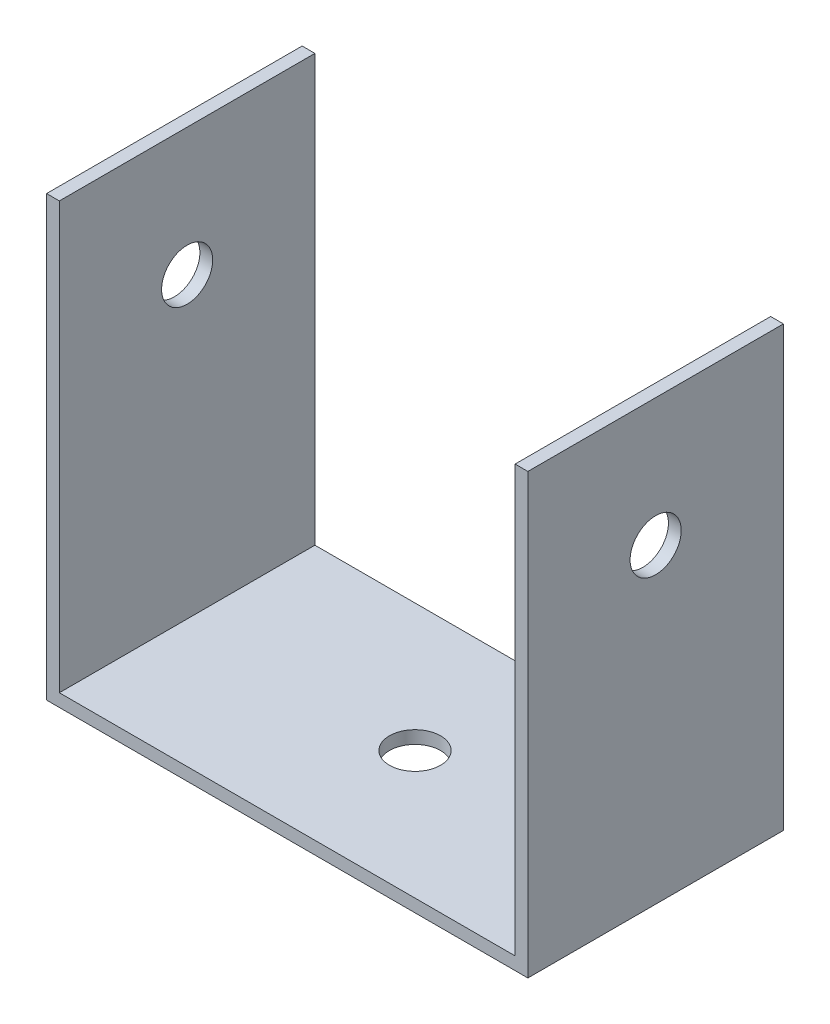
ISO-10303-21;
HEADER;
FILE_DESCRIPTION(('STEP AP214'),'2;1');
FILE_NAME('part.step','',(''),(''),'','','');
FILE_SCHEMA(('AUTOMOTIVE_DESIGN { 1 0 10303 214 1 1 1 1 }'));
ENDSEC;
DATA;
#1=APPLICATION_CONTEXT('core data for automotive mechanical design processes');
#2=APPLICATION_PROTOCOL_DEFINITION('international standard','automotive_design',2000,#1);
#3=PRODUCT_CONTEXT('',#1,'mechanical');
#4=PRODUCT('Part','Part','',(#3));
#5=PRODUCT_RELATED_PRODUCT_CATEGORY('part','',(#4));
#6=PRODUCT_DEFINITION_FORMATION('','',#4);
#7=PRODUCT_DEFINITION_CONTEXT('part definition',#1,'design');
#8=PRODUCT_DEFINITION('design','',#6,#7);
#9=PRODUCT_DEFINITION_SHAPE('','',#8);
#10=(LENGTH_UNIT() NAMED_UNIT(*) SI_UNIT(.MILLI.,.METRE.));
#11=(NAMED_UNIT(*) PLANE_ANGLE_UNIT() SI_UNIT($,.RADIAN.));
#12=(NAMED_UNIT(*) SI_UNIT($,.STERADIAN.) SOLID_ANGLE_UNIT());
#13=UNCERTAINTY_MEASURE_WITH_UNIT(LENGTH_MEASURE(1.E-05),#10,'distance_accuracy_value','');
#14=(GEOMETRIC_REPRESENTATION_CONTEXT(3) GLOBAL_UNCERTAINTY_ASSIGNED_CONTEXT((#13)) GLOBAL_UNIT_ASSIGNED_CONTEXT((#10,
#11,#12)) REPRESENTATION_CONTEXT('',''));
#15=CARTESIAN_POINT('',(0.,0.,0.));
#16=DIRECTION('',(0.,0.,1.));
#17=DIRECTION('',(1.,0.,0.));
#18=AXIS2_PLACEMENT_3D('',#15,#16,#17);
#19=CARTESIAN_POINT('',(26.75,0.,30.));
#20=DIRECTION('',(1.,0.,0.));
#21=DIRECTION('',(0.,0.,-1.));
#22=AXIS2_PLACEMENT_3D('',#19,#20,#21);
#23=PLANE('',#22);
#24=CARTESIAN_POINT('',(26.75,35.,15.));
#25=DIRECTION('',(1.,0.,0.));
#26=DIRECTION('',(0.,0.,-1.));
#27=AXIS2_PLACEMENT_3D('',#24,#25,#26);
#28=CIRCLE('',#27,3.);
#29=CARTESIAN_POINT('',(26.75,32.,15.));
#30=VERTEX_POINT('',#29);
#31=EDGE_CURVE('E134',#30,#30,#28,.T.);
#32=ORIENTED_EDGE('',*,*,#31,.T.);
#33=EDGE_LOOP('',(#32));
#34=FACE_BOUND('',#33,.T.);
#35=DIRECTION('',(0.,-1.,0.));
#36=VECTOR('',#35,1.);
#37=CARTESIAN_POINT('',(26.75,0.,0.));
#38=LINE('',#37,#36);
#39=CARTESIAN_POINT('',(26.75,50.,0.));
#40=VERTEX_POINT('',#39);
#41=CARTESIAN_POINT('',(26.75,0.,0.));
#42=VERTEX_POINT('',#41);
#43=EDGE_CURVE('E130',#40,#42,#38,.T.);
#44=ORIENTED_EDGE('',*,*,#43,.T.);
#45=DIRECTION('',(0.,0.,-1.));
#46=VECTOR('',#45,1.);
#47=CARTESIAN_POINT('',(26.75,0.,30.));
#48=LINE('',#47,#46);
#49=CARTESIAN_POINT('',(26.75,0.,30.));
#50=VERTEX_POINT('',#49);
#51=EDGE_CURVE('E11',#50,#42,#48,.T.);
#52=ORIENTED_EDGE('',*,*,#51,.F.);
#53=DIRECTION('',(0.,-1.,0.));
#54=VECTOR('',#53,1.);
#55=CARTESIAN_POINT('',(26.75,0.,30.));
#56=LINE('',#55,#54);
#57=CARTESIAN_POINT('',(26.75,50.,30.));
#58=VERTEX_POINT('',#57);
#59=EDGE_CURVE('E145',#58,#50,#56,.T.);
#60=ORIENTED_EDGE('',*,*,#59,.F.);
#61=DIRECTION('',(0.,0.,-1.));
#62=VECTOR('',#61,1.);
#63=CARTESIAN_POINT('',(26.75,50.,30.));
#64=LINE('',#63,#62);
#65=EDGE_CURVE('E126',#58,#40,#64,.T.);
#66=ORIENTED_EDGE('',*,*,#65,.T.);
#67=EDGE_LOOP('',(#44,#52,#60,#66));
#68=FACE_BOUND('',#67,.T.);
#69=ADVANCED_FACE('F33',(#34,#68),#23,.F.);
#70=CARTESIAN_POINT('',(26.75,0.,30.));
#71=DIRECTION('',(0.,-1.,0.));
#72=DIRECTION('',(0.,0.,-1.));
#73=AXIS2_PLACEMENT_3D('',#70,#71,#72);
#74=PLANE('',#73);
#75=CARTESIAN_POINT('',(0.,0.,15.));
#76=DIRECTION('',(0.,1.,0.));
#77=DIRECTION('',(0.,0.,1.));
#78=AXIS2_PLACEMENT_3D('',#75,#76,#77);
#79=CIRCLE('',#78,3.);
#80=CARTESIAN_POINT('',(0.,0.,18.));
#81=VERTEX_POINT('',#80);
#82=EDGE_CURVE('E190',#81,#81,#79,.T.);
#83=ORIENTED_EDGE('',*,*,#82,.F.);
#84=EDGE_LOOP('',(#83));
#85=FACE_BOUND('',#84,.T.);
#86=DIRECTION('',(-1.,0.,0.));
#87=VECTOR('',#86,1.);
#88=CARTESIAN_POINT('',(26.75,0.,0.));
#89=LINE('',#88,#87);
#90=CARTESIAN_POINT('',(-26.75,0.,0.));
#91=VERTEX_POINT('',#90);
#92=EDGE_CURVE('E133',#42,#91,#89,.T.);
#93=ORIENTED_EDGE('',*,*,#92,.T.);
#94=DIRECTION('',(0.,0.,-1.));
#95=VECTOR('',#94,1.);
#96=CARTESIAN_POINT('',(-26.75,0.,30.));
#97=LINE('',#96,#95);
#98=CARTESIAN_POINT('',(-26.75,0.,30.));
#99=VERTEX_POINT('',#98);
#100=EDGE_CURVE('E42',#99,#91,#97,.T.);
#101=ORIENTED_EDGE('',*,*,#100,.F.);
#102=DIRECTION('',(-1.,0.,0.));
#103=VECTOR('',#102,1.);
#104=CARTESIAN_POINT('',(26.75,0.,30.));
#105=LINE('',#104,#103);
#106=EDGE_CURVE('E93',#50,#99,#105,.T.);
#107=ORIENTED_EDGE('',*,*,#106,.F.);
#108=ORIENTED_EDGE('',*,*,#51,.T.);
#109=EDGE_LOOP('',(#93,#101,#107,#108));
#110=FACE_BOUND('',#109,.T.);
#111=ADVANCED_FACE('F197',(#85,#110),#74,.F.);
#112=CARTESIAN_POINT('',(-26.75,0.,30.));
#113=DIRECTION('',(-1.,0.,0.));
#114=DIRECTION('',(0.,0.,1.));
#115=AXIS2_PLACEMENT_3D('',#112,#113,#114);
#116=PLANE('',#115);
#117=CARTESIAN_POINT('',(-26.75,35.,15.));
#118=DIRECTION('',(-1.,0.,0.));
#119=DIRECTION('',(0.,0.,1.));
#120=AXIS2_PLACEMENT_3D('',#117,#118,#119);
#121=CIRCLE('',#120,3.);
#122=CARTESIAN_POINT('',(-26.75,32.,15.));
#123=VERTEX_POINT('',#122);
#124=EDGE_CURVE('E181',#123,#123,#121,.T.);
#125=ORIENTED_EDGE('',*,*,#124,.T.);
#126=EDGE_LOOP('',(#125));
#127=FACE_BOUND('',#126,.T.);
#128=DIRECTION('',(0.,1.,0.));
#129=VECTOR('',#128,1.);
#130=CARTESIAN_POINT('',(-26.75,0.,0.));
#131=LINE('',#130,#129);
#132=CARTESIAN_POINT('',(-26.75,50.,0.));
#133=VERTEX_POINT('',#132);
#134=EDGE_CURVE('E136',#91,#133,#131,.T.);
#135=ORIENTED_EDGE('',*,*,#134,.T.);
#136=DIRECTION('',(0.,0.,-1.));
#137=VECTOR('',#136,1.);
#138=CARTESIAN_POINT('',(-26.75,50.,30.));
#139=LINE('',#138,#137);
#140=CARTESIAN_POINT('',(-26.75,50.,30.));
#141=VERTEX_POINT('',#140);
#142=EDGE_CURVE('E152',#141,#133,#139,.T.);
#143=ORIENTED_EDGE('',*,*,#142,.F.);
#144=DIRECTION('',(0.,1.,0.));
#145=VECTOR('',#144,1.);
#146=CARTESIAN_POINT('',(-26.75,0.,30.));
#147=LINE('',#146,#145);
#148=EDGE_CURVE('E161',#99,#141,#147,.T.);
#149=ORIENTED_EDGE('',*,*,#148,.F.);
#150=ORIENTED_EDGE('',*,*,#100,.T.);
#151=EDGE_LOOP('',(#135,#143,#149,#150));
#152=FACE_BOUND('',#151,.T.);
#153=ADVANCED_FACE('F159',(#127,#152),#116,.F.);
#154=CARTESIAN_POINT('',(-26.75,50.,30.));
#155=DIRECTION('',(0.,-1.,0.));
#156=DIRECTION('',(0.,0.,-1.));
#157=AXIS2_PLACEMENT_3D('',#154,#155,#156);
#158=PLANE('',#157);
#159=DIRECTION('',(-1.,0.,0.));
#160=VECTOR('',#159,1.);
#161=CARTESIAN_POINT('',(-26.75,50.,0.));
#162=LINE('',#161,#160);
#163=CARTESIAN_POINT('',(-28.25,50.,0.));
#164=VERTEX_POINT('',#163);
#165=EDGE_CURVE('E138',#133,#164,#162,.T.);
#166=ORIENTED_EDGE('',*,*,#165,.T.);
#167=DIRECTION('',(0.,0.,-1.));
#168=VECTOR('',#167,1.);
#169=CARTESIAN_POINT('',(-28.25,50.,30.));
#170=LINE('',#169,#168);
#171=CARTESIAN_POINT('',(-28.25,50.,30.));
#172=VERTEX_POINT('',#171);
#173=EDGE_CURVE('E149',#172,#164,#170,.T.);
#174=ORIENTED_EDGE('',*,*,#173,.F.);
#175=DIRECTION('',(-1.,0.,0.));
#176=VECTOR('',#175,1.);
#177=CARTESIAN_POINT('',(-26.75,50.,30.));
#178=LINE('',#177,#176);
#179=EDGE_CURVE('E173',#141,#172,#178,.T.);
#180=ORIENTED_EDGE('',*,*,#179,.F.);
#181=ORIENTED_EDGE('',*,*,#142,.T.);
#182=EDGE_LOOP('',(#166,#174,#180,#181));
#183=FACE_BOUND('',#182,.T.);
#184=ADVANCED_FACE('F169',(#183),#158,.F.);
#185=CARTESIAN_POINT('',(-28.25,50.,30.));
#186=DIRECTION('',(1.,0.,0.));
#187=DIRECTION('',(0.,1.,0.));
#188=AXIS2_PLACEMENT_3D('',#185,#186,#187);
#189=PLANE('',#188);
#190=CARTESIAN_POINT('',(-28.25,35.,15.));
#191=DIRECTION('',(-1.,0.,0.));
#192=DIRECTION('',(0.,-1.,0.));
#193=AXIS2_PLACEMENT_3D('',#190,#191,#192);
#194=CIRCLE('',#193,3.);
#195=CARTESIAN_POINT('',(-28.25,32.,15.));
#196=VERTEX_POINT('',#195);
#197=EDGE_CURVE('E184',#196,#196,#194,.T.);
#198=ORIENTED_EDGE('',*,*,#197,.F.);
#199=EDGE_LOOP('',(#198));
#200=FACE_BOUND('',#199,.T.);
#201=DIRECTION('',(0.,-1.,0.));
#202=VECTOR('',#201,1.);
#203=CARTESIAN_POINT('',(-28.25,50.,0.));
#204=LINE('',#203,#202);
#205=CARTESIAN_POINT('',(-28.25,-1.50000000000001,0.));
#206=VERTEX_POINT('',#205);
#207=EDGE_CURVE('E140',#164,#206,#204,.T.);
#208=ORIENTED_EDGE('',*,*,#207,.T.);
#209=DIRECTION('',(0.,0.,-1.));
#210=VECTOR('',#209,1.);
#211=CARTESIAN_POINT('',(-28.25,-1.50000000000001,30.));
#212=LINE('',#211,#210);
#213=CARTESIAN_POINT('',(-28.25,-1.50000000000001,30.));
#214=VERTEX_POINT('',#213);
#215=EDGE_CURVE('E121',#214,#206,#212,.T.);
#216=ORIENTED_EDGE('',*,*,#215,.F.);
#217=DIRECTION('',(0.,-1.,0.));
#218=VECTOR('',#217,1.);
#219=CARTESIAN_POINT('',(-28.25,50.,30.));
#220=LINE('',#219,#218);
#221=EDGE_CURVE('E112',#172,#214,#220,.T.);
#222=ORIENTED_EDGE('',*,*,#221,.F.);
#223=ORIENTED_EDGE('',*,*,#173,.T.);
#224=EDGE_LOOP('',(#208,#216,#222,#223));
#225=FACE_BOUND('',#224,.T.);
#226=ADVANCED_FACE('F172',(#200,#225),#189,.F.);
#227=CARTESIAN_POINT('',(-28.25,-1.50000000000001,30.));
#228=DIRECTION('',(0.,1.,0.));
#229=DIRECTION('',(0.,0.,1.));
#230=AXIS2_PLACEMENT_3D('',#227,#228,#229);
#231=PLANE('',#230);
#232=CARTESIAN_POINT('',(0.,-1.50000000000001,15.));
#233=DIRECTION('',(0.,1.,0.));
#234=DIRECTION('',(0.,0.,1.));
#235=AXIS2_PLACEMENT_3D('',#232,#233,#234);
#236=CIRCLE('',#235,3.);
#237=CARTESIAN_POINT('',(0.,-1.50000000000001,18.));
#238=VERTEX_POINT('',#237);
#239=EDGE_CURVE('E187',#238,#238,#236,.F.);
#240=ORIENTED_EDGE('',*,*,#239,.F.);
#241=EDGE_LOOP('',(#240));
#242=FACE_BOUND('',#241,.T.);
#243=DIRECTION('',(1.,0.,0.));
#244=VECTOR('',#243,1.);
#245=CARTESIAN_POINT('',(-28.25,-1.50000000000001,0.));
#246=LINE('',#245,#244);
#247=CARTESIAN_POINT('',(28.25,-1.50000000000001,0.));
#248=VERTEX_POINT('',#247);
#249=EDGE_CURVE('E120',#206,#248,#246,.T.);
#250=ORIENTED_EDGE('',*,*,#249,.T.);
#251=DIRECTION('',(0.,0.,-1.));
#252=VECTOR('',#251,1.);
#253=CARTESIAN_POINT('',(28.25,-1.50000000000001,30.));
#254=LINE('',#253,#252);
#255=CARTESIAN_POINT('',(28.25,-1.50000000000001,30.));
#256=VERTEX_POINT('',#255);
#257=EDGE_CURVE('E117',#256,#248,#254,.T.);
#258=ORIENTED_EDGE('',*,*,#257,.F.);
#259=DIRECTION('',(1.,0.,0.));
#260=VECTOR('',#259,1.);
#261=CARTESIAN_POINT('',(-28.25,-1.50000000000001,30.));
#262=LINE('',#261,#260);
#263=EDGE_CURVE('E106',#214,#256,#262,.T.);
#264=ORIENTED_EDGE('',*,*,#263,.F.);
#265=ORIENTED_EDGE('',*,*,#215,.T.);
#266=EDGE_LOOP('',(#250,#258,#264,#265));
#267=FACE_BOUND('',#266,.T.);
#268=ADVANCED_FACE('F118',(#242,#267),#231,.F.);
#269=CARTESIAN_POINT('',(28.25,50.,30.));
#270=DIRECTION('',(-1.,0.,0.));
#271=DIRECTION('',(0.,-1.,0.));
#272=AXIS2_PLACEMENT_3D('',#269,#270,#271);
#273=PLANE('',#272);
#274=CARTESIAN_POINT('',(28.25,35.,15.));
#275=DIRECTION('',(-1.,0.,0.));
#276=DIRECTION('',(0.,-1.,0.));
#277=AXIS2_PLACEMENT_3D('',#274,#275,#276);
#278=CIRCLE('',#277,3.);
#279=CARTESIAN_POINT('',(28.25,32.,15.));
#280=VERTEX_POINT('',#279);
#281=EDGE_CURVE('E36',#280,#280,#278,.T.);
#282=ORIENTED_EDGE('',*,*,#281,.T.);
#283=EDGE_LOOP('',(#282));
#284=FACE_BOUND('',#283,.T.);
#285=DIRECTION('',(0.,1.,0.));
#286=VECTOR('',#285,1.);
#287=CARTESIAN_POINT('',(28.25,50.,0.));
#288=LINE('',#287,#286);
#289=CARTESIAN_POINT('',(28.25,50.,0.));
#290=VERTEX_POINT('',#289);
#291=EDGE_CURVE('E79',#248,#290,#288,.T.);
#292=ORIENTED_EDGE('',*,*,#291,.T.);
#293=DIRECTION('',(0.,0.,-1.));
#294=VECTOR('',#293,1.);
#295=CARTESIAN_POINT('',(28.25,50.,30.));
#296=LINE('',#295,#294);
#297=CARTESIAN_POINT('',(28.25,50.,30.));
#298=VERTEX_POINT('',#297);
#299=EDGE_CURVE('E122',#298,#290,#296,.T.);
#300=ORIENTED_EDGE('',*,*,#299,.F.);
#301=DIRECTION('',(0.,1.,0.));
#302=VECTOR('',#301,1.);
#303=CARTESIAN_POINT('',(28.25,50.,30.));
#304=LINE('',#303,#302);
#305=EDGE_CURVE('E110',#256,#298,#304,.T.);
#306=ORIENTED_EDGE('',*,*,#305,.F.);
#307=ORIENTED_EDGE('',*,*,#257,.T.);
#308=EDGE_LOOP('',(#292,#300,#306,#307));
#309=FACE_BOUND('',#308,.T.);
#310=ADVANCED_FACE('F124',(#284,#309),#273,.F.);
#311=CARTESIAN_POINT('',(26.75,50.,30.));
#312=DIRECTION('',(0.,-1.,0.));
#313=DIRECTION('',(0.,0.,-1.));
#314=AXIS2_PLACEMENT_3D('',#311,#312,#313);
#315=PLANE('',#314);
#316=DIRECTION('',(-1.,0.,0.));
#317=VECTOR('',#316,1.);
#318=CARTESIAN_POINT('',(26.75,50.,0.));
#319=LINE('',#318,#317);
#320=EDGE_CURVE('E85',#290,#40,#319,.T.);
#321=ORIENTED_EDGE('',*,*,#320,.T.);
#322=ORIENTED_EDGE('',*,*,#65,.F.);
#323=DIRECTION('',(-1.,0.,0.));
#324=VECTOR('',#323,1.);
#325=CARTESIAN_POINT('',(26.75,50.,30.));
#326=LINE('',#325,#324);
#327=EDGE_CURVE('E50',#298,#58,#326,.T.);
#328=ORIENTED_EDGE('',*,*,#327,.F.);
#329=ORIENTED_EDGE('',*,*,#299,.T.);
#330=EDGE_LOOP('',(#321,#322,#328,#329));
#331=FACE_BOUND('',#330,.T.);
#332=ADVANCED_FACE('F202',(#331),#315,.F.);
#333=CARTESIAN_POINT('',(0.,0.,30.));
#334=DIRECTION('',(0.,0.,-1.));
#335=DIRECTION('',(-1.,0.,0.));
#336=AXIS2_PLACEMENT_3D('',#333,#334,#335);
#337=PLANE('',#336);
#338=ORIENTED_EDGE('',*,*,#59,.T.);
#339=ORIENTED_EDGE('',*,*,#106,.T.);
#340=ORIENTED_EDGE('',*,*,#148,.T.);
#341=ORIENTED_EDGE('',*,*,#179,.T.);
#342=ORIENTED_EDGE('',*,*,#221,.T.);
#343=ORIENTED_EDGE('',*,*,#263,.T.);
#344=ORIENTED_EDGE('',*,*,#305,.T.);
#345=ORIENTED_EDGE('',*,*,#327,.T.);
#346=EDGE_LOOP('',(#338,#339,#340,#341,#342,#343,#344,#345));
#347=FACE_BOUND('',#346,.T.);
#348=ADVANCED_FACE('F108',(#347),#337,.F.);
#349=CARTESIAN_POINT('',(0.,0.,0.));
#350=DIRECTION('',(0.,0.,-1.));
#351=DIRECTION('',(-1.,0.,0.));
#352=AXIS2_PLACEMENT_3D('',#349,#350,#351);
#353=PLANE('',#352);
#354=ORIENTED_EDGE('',*,*,#43,.F.);
#355=ORIENTED_EDGE('',*,*,#320,.F.);
#356=ORIENTED_EDGE('',*,*,#291,.F.);
#357=ORIENTED_EDGE('',*,*,#249,.F.);
#358=ORIENTED_EDGE('',*,*,#207,.F.);
#359=ORIENTED_EDGE('',*,*,#165,.F.);
#360=ORIENTED_EDGE('',*,*,#134,.F.);
#361=ORIENTED_EDGE('',*,*,#92,.F.);
#362=EDGE_LOOP('',(#354,#355,#356,#357,#358,#359,#360,#361));
#363=FACE_BOUND('',#362,.T.);
#364=ADVANCED_FACE('F165',(#363),#353,.T.);
#365=CARTESIAN_POINT('',(31.75,35.,15.));
#366=DIRECTION('',(-1.,0.,0.));
#367=DIRECTION('',(0.,-1.,0.));
#368=AXIS2_PLACEMENT_3D('',#365,#366,#367);
#369=CYLINDRICAL_SURFACE('',#368,3.);
#370=CARTESIAN_POINT('',(28.25,32.,15.));
#371=CARTESIAN_POINT('',(28.234375,32.,15.));
#372=CARTESIAN_POINT('',(28.21875,32.,15.));
#373=CARTESIAN_POINT('',(28.1875,32.,15.));
#374=CARTESIAN_POINT('',(28.171875,32.,15.));
#375=CARTESIAN_POINT('',(28.140625,32.,15.));
#376=CARTESIAN_POINT('',(28.125,32.,15.));
#377=CARTESIAN_POINT('',(28.09375,32.,15.));
#378=CARTESIAN_POINT('',(28.078125,32.,15.));
#379=CARTESIAN_POINT('',(28.046875,32.,15.));
#380=CARTESIAN_POINT('',(28.03125,32.,15.));
#381=CARTESIAN_POINT('',(28.,32.,15.));
#382=CARTESIAN_POINT('',(27.984375,32.,15.));
#383=CARTESIAN_POINT('',(27.953125,32.,15.));
#384=CARTESIAN_POINT('',(27.9375,32.,15.));
#385=CARTESIAN_POINT('',(27.90625,32.,15.));
#386=CARTESIAN_POINT('',(27.890625,32.,15.));
#387=CARTESIAN_POINT('',(27.859375,32.,15.));
#388=CARTESIAN_POINT('',(27.84375,32.,15.));
#389=CARTESIAN_POINT('',(27.8125,32.,15.));
#390=CARTESIAN_POINT('',(27.796875,32.,15.));
#391=CARTESIAN_POINT('',(27.765625,32.,15.));
#392=CARTESIAN_POINT('',(27.75,32.,15.));
#393=CARTESIAN_POINT('',(27.71875,32.,15.));
#394=CARTESIAN_POINT('',(27.703125,32.,15.));
#395=CARTESIAN_POINT('',(27.671875,32.,15.));
#396=CARTESIAN_POINT('',(27.65625,32.,15.));
#397=CARTESIAN_POINT('',(27.625,32.,15.));
#398=CARTESIAN_POINT('',(27.609375,32.,15.));
#399=CARTESIAN_POINT('',(27.578125,32.,15.));
#400=CARTESIAN_POINT('',(27.5625,32.,15.));
#401=CARTESIAN_POINT('',(27.53125,32.,15.));
#402=CARTESIAN_POINT('',(27.515625,32.,15.));
#403=CARTESIAN_POINT('',(27.484375,32.,15.));
#404=CARTESIAN_POINT('',(27.46875,32.,15.));
#405=CARTESIAN_POINT('',(27.4375,32.,15.));
#406=CARTESIAN_POINT('',(27.421875,32.,15.));
#407=CARTESIAN_POINT('',(27.390625,32.,15.));
#408=CARTESIAN_POINT('',(27.375,32.,15.));
#409=CARTESIAN_POINT('',(27.34375,32.,15.));
#410=CARTESIAN_POINT('',(27.328125,32.,15.));
#411=CARTESIAN_POINT('',(27.296875,32.,15.));
#412=CARTESIAN_POINT('',(27.28125,32.,15.));
#413=CARTESIAN_POINT('',(27.25,32.,15.));
#414=CARTESIAN_POINT('',(27.234375,32.,15.));
#415=CARTESIAN_POINT('',(27.203125,32.,15.));
#416=CARTESIAN_POINT('',(27.1875,32.,15.));
#417=CARTESIAN_POINT('',(27.15625,32.,15.));
#418=CARTESIAN_POINT('',(27.140625,32.,15.));
#419=CARTESIAN_POINT('',(27.109375,32.,15.));
#420=CARTESIAN_POINT('',(27.09375,32.,15.));
#421=CARTESIAN_POINT('',(27.0625,32.,15.));
#422=CARTESIAN_POINT('',(27.046875,32.,15.));
#423=CARTESIAN_POINT('',(27.015625,32.,15.));
#424=CARTESIAN_POINT('',(27.,32.,15.));
#425=CARTESIAN_POINT('',(26.96875,32.,15.));
#426=CARTESIAN_POINT('',(26.953125,32.,15.));
#427=CARTESIAN_POINT('',(26.921875,32.,15.));
#428=CARTESIAN_POINT('',(26.90625,32.,15.));
#429=CARTESIAN_POINT('',(26.875,32.,15.));
#430=CARTESIAN_POINT('',(26.859375,32.,15.));
#431=CARTESIAN_POINT('',(26.828125,32.,15.));
#432=CARTESIAN_POINT('',(26.8125,32.,15.));
#433=CARTESIAN_POINT('',(26.78125,32.,15.));
#434=CARTESIAN_POINT('',(26.765625,32.,15.));
#435=CARTESIAN_POINT('',(26.75,32.,15.));
#436=B_SPLINE_CURVE_WITH_KNOTS('',3,(#370,#371,#372,#373,#374,#375,#376,#377,#378,#379,#380,
#381,#382,#383,#384,#385,#386,#387,#388,#389,#390,#391,#392,#393,#394,#395,#396,#397,#398,#399,
#400,#401,#402,#403,#404,#405,#406,#407,#408,#409,#410,#411,#412,#413,#414,#415,#416,#417,#418,
#419,#420,#421,#422,#423,#424,#425,#426,#427,#428,#429,#430,#431,#432,#433,#434,#435),
.UNSPECIFIED.,.F.,.F.,(4,2,2,2,2,2,2,2,2,2,2,2,2,2,2,2,2,2,2,2,2,2,2,2,2,2,2,2,2,2,2,2,4),(0.,
0.0468749999999983,0.0937500000000001,0.140624999999998,0.187499999999997,0.234374999999998,
0.281249999999997,0.328124999999999,0.374999999999997,0.421874999999999,0.468749999999997,
0.515624999999995,0.562499999999997,0.609374999999999,0.656249999999997,0.703124999999995,
0.749999999999997,0.796874999999996,0.843749999999997,0.890624999999996,0.937499999999997,
0.984374999999996,1.03125,1.078125,1.125,1.171875,1.21874999999999,1.265625,1.31249999999999,
1.359375,1.40624999999999,1.453125,1.49999999999999),.UNSPECIFIED.);
#437=EDGE_CURVE('BSEAM219',#280,#30,#436,.T.);
#438=ORIENTED_EDGE('',*,*,#281,.F.);
#439=ORIENTED_EDGE('',*,*,#31,.F.);
#440=ORIENTED_EDGE('',*,*,#437,.T.);
#441=ORIENTED_EDGE('',*,*,#437,.F.);
#442=EDGE_LOOP('',(#438,#440,#439,#441));
#443=FACE_BOUND('',#442,.T.);
#444=ADVANCED_FACE('F219',(#443),#369,.F.);
#445=CARTESIAN_POINT('',(-28.25,32.,15.));
#446=CARTESIAN_POINT('',(-28.234375,32.,15.));
#447=CARTESIAN_POINT('',(-28.21875,32.,15.));
#448=CARTESIAN_POINT('',(-28.1875,32.,15.));
#449=CARTESIAN_POINT('',(-28.171875,32.,15.));
#450=CARTESIAN_POINT('',(-28.140625,32.,15.));
#451=CARTESIAN_POINT('',(-28.125,32.,15.));
#452=CARTESIAN_POINT('',(-28.09375,32.,15.));
#453=CARTESIAN_POINT('',(-28.078125,32.,15.));
#454=CARTESIAN_POINT('',(-28.046875,32.,15.));
#455=CARTESIAN_POINT('',(-28.03125,32.,15.));
#456=CARTESIAN_POINT('',(-28.,32.,15.));
#457=CARTESIAN_POINT('',(-27.984375,32.,15.));
#458=CARTESIAN_POINT('',(-27.953125,32.,15.));
#459=CARTESIAN_POINT('',(-27.9375,32.,15.));
#460=CARTESIAN_POINT('',(-27.90625,32.,15.));
#461=CARTESIAN_POINT('',(-27.890625,32.,15.));
#462=CARTESIAN_POINT('',(-27.859375,32.,15.));
#463=CARTESIAN_POINT('',(-27.84375,32.,15.));
#464=CARTESIAN_POINT('',(-27.8125,32.,15.));
#465=CARTESIAN_POINT('',(-27.796875,32.,15.));
#466=CARTESIAN_POINT('',(-27.765625,32.,15.));
#467=CARTESIAN_POINT('',(-27.75,32.,15.));
#468=CARTESIAN_POINT('',(-27.71875,32.,15.));
#469=CARTESIAN_POINT('',(-27.703125,32.,15.));
#470=CARTESIAN_POINT('',(-27.671875,32.,15.));
#471=CARTESIAN_POINT('',(-27.65625,32.,15.));
#472=CARTESIAN_POINT('',(-27.625,32.,15.));
#473=CARTESIAN_POINT('',(-27.609375,32.,15.));
#474=CARTESIAN_POINT('',(-27.578125,32.,15.));
#475=CARTESIAN_POINT('',(-27.5625,32.,15.));
#476=CARTESIAN_POINT('',(-27.53125,32.,15.));
#477=CARTESIAN_POINT('',(-27.515625,32.,15.));
#478=CARTESIAN_POINT('',(-27.484375,32.,15.));
#479=CARTESIAN_POINT('',(-27.46875,32.,15.));
#480=CARTESIAN_POINT('',(-27.4375,32.,15.));
#481=CARTESIAN_POINT('',(-27.421875,32.,15.));
#482=CARTESIAN_POINT('',(-27.390625,32.,15.));
#483=CARTESIAN_POINT('',(-27.375,32.,15.));
#484=CARTESIAN_POINT('',(-27.34375,32.,15.));
#485=CARTESIAN_POINT('',(-27.328125,32.,15.));
#486=CARTESIAN_POINT('',(-27.296875,32.,15.));
#487=CARTESIAN_POINT('',(-27.28125,32.,15.));
#488=CARTESIAN_POINT('',(-27.25,32.,15.));
#489=CARTESIAN_POINT('',(-27.234375,32.,15.));
#490=CARTESIAN_POINT('',(-27.203125,32.,15.));
#491=CARTESIAN_POINT('',(-27.1875,32.,15.));
#492=CARTESIAN_POINT('',(-27.15625,32.,15.));
#493=CARTESIAN_POINT('',(-27.140625,32.,15.));
#494=CARTESIAN_POINT('',(-27.109375,32.,15.));
#495=CARTESIAN_POINT('',(-27.09375,32.,15.));
#496=CARTESIAN_POINT('',(-27.0625,32.,15.));
#497=CARTESIAN_POINT('',(-27.046875,32.,15.));
#498=CARTESIAN_POINT('',(-27.015625,32.,15.));
#499=CARTESIAN_POINT('',(-27.,32.,15.));
#500=CARTESIAN_POINT('',(-26.96875,32.,15.));
#501=CARTESIAN_POINT('',(-26.953125,32.,15.));
#502=CARTESIAN_POINT('',(-26.921875,32.,15.));
#503=CARTESIAN_POINT('',(-26.90625,32.,15.));
#504=CARTESIAN_POINT('',(-26.875,32.,15.));
#505=CARTESIAN_POINT('',(-26.859375,32.,15.));
#506=CARTESIAN_POINT('',(-26.828125,32.,15.));
#507=CARTESIAN_POINT('',(-26.8125,32.,15.));
#508=CARTESIAN_POINT('',(-26.78125,32.,15.));
#509=CARTESIAN_POINT('',(-26.765625,32.,15.));
#510=CARTESIAN_POINT('',(-26.75,32.,15.));
#511=B_SPLINE_CURVE_WITH_KNOTS('',3,(#445,#446,#447,#448,#449,#450,#451,#452,#453,#454,#455,
#456,#457,#458,#459,#460,#461,#462,#463,#464,#465,#466,#467,#468,#469,#470,#471,#472,#473,#474,
#475,#476,#477,#478,#479,#480,#481,#482,#483,#484,#485,#486,#487,#488,#489,#490,#491,#492,#493,
#494,#495,#496,#497,#498,#499,#500,#501,#502,#503,#504,#505,#506,#507,#508,#509,#510),
.UNSPECIFIED.,.F.,.F.,(4,2,2,2,2,2,2,2,2,2,2,2,2,2,2,2,2,2,2,2,2,2,2,2,2,2,2,2,2,2,2,2,4),(0.,
0.0468750000000018,0.0937500000000036,0.140624999999998,0.1875,0.234375000000002,
0.281249999999997,0.328124999999999,0.375,0.421875000000002,0.468750000000004,0.515624999999999,
0.5625,0.609375000000002,0.656249999999997,0.703124999999999,0.750000000000001,
0.796875000000002,0.843750000000004,0.890624999999999,0.937500000000001,0.984375000000003,
1.03125,1.078125,1.125,1.171875,1.21875,1.265625,1.3125,1.359375,1.40625,1.453125,1.5),.UNSPECIFIED.);
#512=EDGE_CURVE('BSEAM221',#196,#123,#511,.T.);
#513=ORIENTED_EDGE('',*,*,#197,.T.);
#514=ORIENTED_EDGE('',*,*,#124,.F.);
#515=ORIENTED_EDGE('',*,*,#512,.T.);
#516=ORIENTED_EDGE('',*,*,#512,.F.);
#517=EDGE_LOOP('',(#513,#515,#514,#516));
#518=FACE_BOUND('',#517,.T.);
#519=ADVANCED_FACE('F221',(#518),#369,.F.);
#520=CARTESIAN_POINT('',(0.,-1.50100000000001,15.));
#521=DIRECTION('',(0.,1.,0.));
#522=DIRECTION('',(0.,0.,1.));
#523=AXIS2_PLACEMENT_3D('',#520,#521,#522);
#524=CYLINDRICAL_SURFACE('',#523,3.);
#525=ORIENTED_EDGE('',*,*,#82,.T.);
#526=EDGE_LOOP('',(#525));
#527=FACE_BOUND('',#526,.T.);
#528=ORIENTED_EDGE('',*,*,#239,.T.);
#529=EDGE_LOOP('',(#528));
#530=FACE_BOUND('',#529,.T.);
#531=ADVANCED_FACE('F194',(#527,#530),#524,.F.);
#532=CLOSED_SHELL('',(#69,#111,#153,#184,#226,#268,#310,#332,#348,#364,#444,#519,#531));
#533=MANIFOLD_SOLID_BREP('B2',#532);
#534=ADVANCED_BREP_SHAPE_REPRESENTATION('',(#18,#533),#14);
#535=SHAPE_DEFINITION_REPRESENTATION(#9,#534);
ENDSEC;
END-ISO-10303-21;
